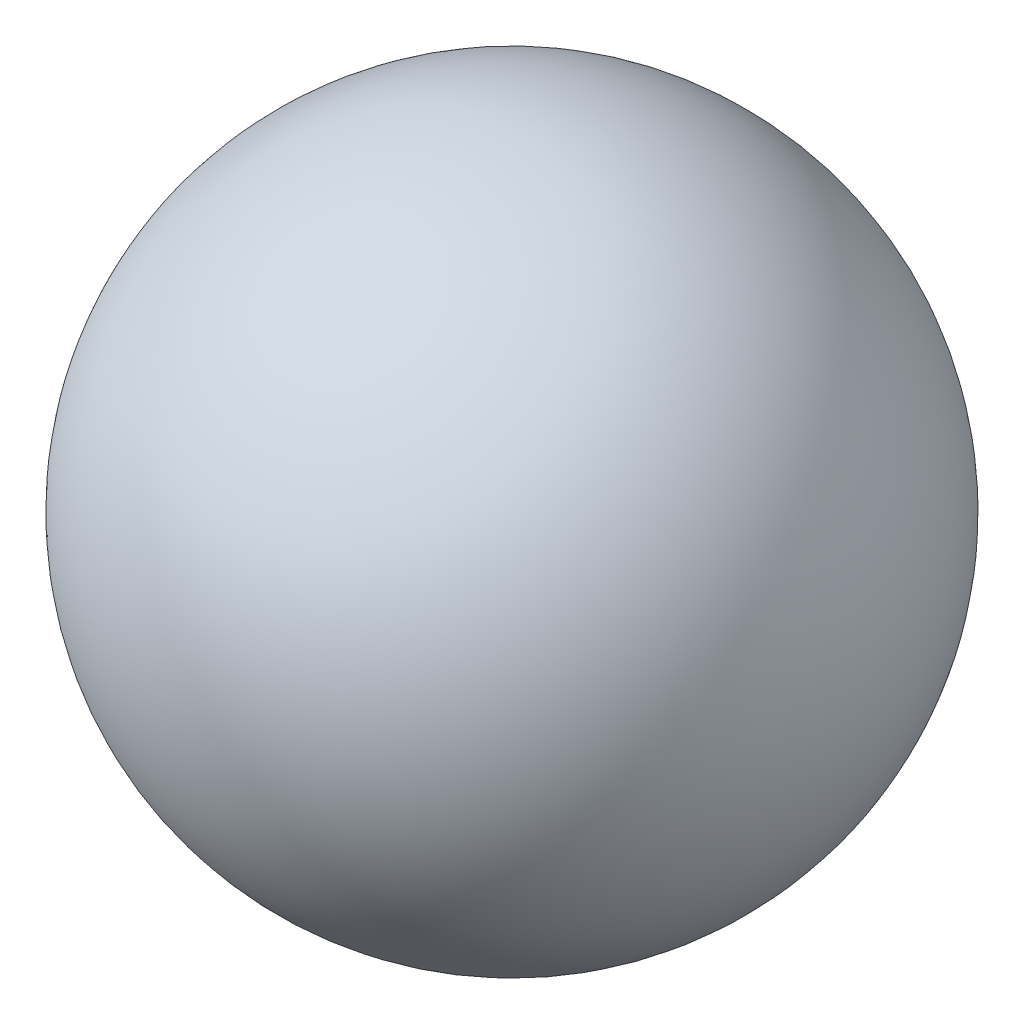
ISO-10303-21;
HEADER;
FILE_DESCRIPTION(('STEP AP214'),'2;1');
FILE_NAME('part.step','',(''),(''),'','','');
FILE_SCHEMA(('AUTOMOTIVE_DESIGN { 1 0 10303 214 1 1 1 1 }'));
ENDSEC;
DATA;
#1=APPLICATION_CONTEXT('core data for automotive mechanical design processes');
#2=APPLICATION_PROTOCOL_DEFINITION('international standard','automotive_design',2000,#1);
#3=PRODUCT_CONTEXT('',#1,'mechanical');
#4=PRODUCT('Part','Part','',(#3));
#5=PRODUCT_RELATED_PRODUCT_CATEGORY('part','',(#4));
#6=PRODUCT_DEFINITION_FORMATION('','',#4);
#7=PRODUCT_DEFINITION_CONTEXT('part definition',#1,'design');
#8=PRODUCT_DEFINITION('design','',#6,#7);
#9=PRODUCT_DEFINITION_SHAPE('','',#8);
#10=(LENGTH_UNIT() NAMED_UNIT(*) SI_UNIT(.MILLI.,.METRE.));
#11=(NAMED_UNIT(*) PLANE_ANGLE_UNIT() SI_UNIT($,.RADIAN.));
#12=(NAMED_UNIT(*) SI_UNIT($,.STERADIAN.) SOLID_ANGLE_UNIT());
#13=UNCERTAINTY_MEASURE_WITH_UNIT(LENGTH_MEASURE(1.E-05),#10,'distance_accuracy_value','');
#14=(GEOMETRIC_REPRESENTATION_CONTEXT(3) GLOBAL_UNCERTAINTY_ASSIGNED_CONTEXT((#13)) GLOBAL_UNIT_ASSIGNED_CONTEXT((#10,
#11,#12)) REPRESENTATION_CONTEXT('',''));
#15=CARTESIAN_POINT('',(0.,0.,0.));
#16=DIRECTION('',(0.,0.,1.));
#17=DIRECTION('',(1.,0.,0.));
#18=AXIS2_PLACEMENT_3D('',#15,#16,#17);
#19=CARTESIAN_POINT('',(12.,0.,0.));
#20=DIRECTION('',(-1.,0.,0.));
#21=DIRECTION('',(0.,1.,0.));
#22=AXIS2_PLACEMENT_3D('',#19,#20,#21);
#23=SPHERICAL_SURFACE('',#22,12.);
#24=CARTESIAN_POINT('',(0.,0.,0.));
#25=VERTEX_POINT('',#24);
#26=VERTEX_LOOP('',#25);
#27=FACE_BOUND('',#26,.T.);
#28=ADVANCED_FACE('F33',(#27),#23,.T.);
#29=CLOSED_SHELL('',(#28));
#30=MANIFOLD_SOLID_BREP('B2',#29);
#31=ADVANCED_BREP_SHAPE_REPRESENTATION('',(#18,#30),#14);
#32=SHAPE_DEFINITION_REPRESENTATION(#9,#31);
ENDSEC;
END-ISO-10303-21;
